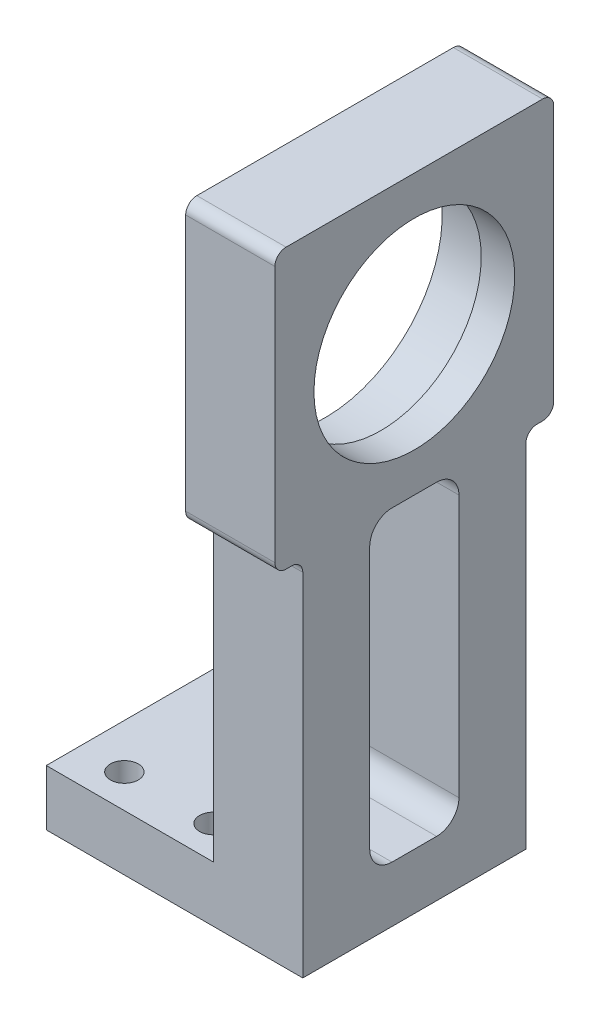
ISO-10303-21;
HEADER;
FILE_DESCRIPTION(('STEP AP214'),'2;1');
FILE_NAME('part.step','',(''),(''),'','','');
FILE_SCHEMA(('AUTOMOTIVE_DESIGN { 1 0 10303 214 1 1 1 1 }'));
ENDSEC;
DATA;
#1=APPLICATION_CONTEXT('core data for automotive mechanical design processes');
#2=APPLICATION_PROTOCOL_DEFINITION('international standard','automotive_design',2000,#1);
#3=PRODUCT_CONTEXT('',#1,'mechanical');
#4=PRODUCT('Part','Part','',(#3));
#5=PRODUCT_RELATED_PRODUCT_CATEGORY('part','',(#4));
#6=PRODUCT_DEFINITION_FORMATION('','',#4);
#7=PRODUCT_DEFINITION_CONTEXT('part definition',#1,'design');
#8=PRODUCT_DEFINITION('design','',#6,#7);
#9=PRODUCT_DEFINITION_SHAPE('','',#8);
#10=(LENGTH_UNIT() NAMED_UNIT(*) SI_UNIT(.MILLI.,.METRE.));
#11=(NAMED_UNIT(*) PLANE_ANGLE_UNIT() SI_UNIT($,.RADIAN.));
#12=(NAMED_UNIT(*) SI_UNIT($,.STERADIAN.) SOLID_ANGLE_UNIT());
#13=UNCERTAINTY_MEASURE_WITH_UNIT(LENGTH_MEASURE(1.E-05),#10,'distance_accuracy_value','');
#14=(GEOMETRIC_REPRESENTATION_CONTEXT(3) GLOBAL_UNCERTAINTY_ASSIGNED_CONTEXT((#13)) GLOBAL_UNIT_ASSIGNED_CONTEXT((#10,
#11,#12)) REPRESENTATION_CONTEXT('',''));
#15=CARTESIAN_POINT('',(0.,0.,0.));
#16=DIRECTION('',(0.,0.,1.));
#17=DIRECTION('',(1.,0.,0.));
#18=AXIS2_PLACEMENT_3D('',#15,#16,#17);
#19=CARTESIAN_POINT('',(0.,5.,0.));
#20=DIRECTION('',(0.,-1.,0.));
#21=DIRECTION('',(0.,0.,-1.));
#22=AXIS2_PLACEMENT_3D('',#19,#20,#21);
#23=PLANE('',#22);
#24=CARTESIAN_POINT('',(4.,5.,-3.));
#25=DIRECTION('',(0.,1.,0.));
#26=DIRECTION('',(0.,0.,1.));
#27=AXIS2_PLACEMENT_3D('',#24,#25,#26);
#28=CIRCLE('',#27,1.25);
#29=CARTESIAN_POINT('',(4.,5.,-1.75));
#30=VERTEX_POINT('',#29);
#31=EDGE_CURVE('E820',#30,#30,#28,.T.);
#32=ORIENTED_EDGE('',*,*,#31,.F.);
#33=EDGE_LOOP('',(#32));
#34=FACE_BOUND('',#33,.T.);
#35=CARTESIAN_POINT('',(12.,5.,-17.));
#36=DIRECTION('',(0.,1.,0.));
#37=DIRECTION('',(0.,0.,-1.));
#38=AXIS2_PLACEMENT_3D('',#35,#36,#37);
#39=CIRCLE('',#38,1.25);
#40=CARTESIAN_POINT('',(12.,5.,-18.25));
#41=VERTEX_POINT('',#40);
#42=EDGE_CURVE('E827',#41,#41,#39,.T.);
#43=ORIENTED_EDGE('',*,*,#42,.F.);
#44=EDGE_LOOP('',(#43));
#45=FACE_BOUND('',#44,.T.);
#46=CARTESIAN_POINT('',(4.,5.,-17.));
#47=DIRECTION('',(0.,1.,0.));
#48=DIRECTION('',(0.,0.,-1.));
#49=AXIS2_PLACEMENT_3D('',#46,#47,#48);
#50=CIRCLE('',#49,1.25);
#51=CARTESIAN_POINT('',(4.,5.,-18.25));
#52=VERTEX_POINT('',#51);
#53=EDGE_CURVE('E809',#52,#52,#50,.T.);
#54=ORIENTED_EDGE('',*,*,#53,.F.);
#55=EDGE_LOOP('',(#54));
#56=FACE_BOUND('',#55,.T.);
#57=CARTESIAN_POINT('',(12.,5.,-3.));
#58=DIRECTION('',(0.,1.,0.));
#59=DIRECTION('',(0.,0.,1.));
#60=AXIS2_PLACEMENT_3D('',#57,#58,#59);
#61=CIRCLE('',#60,1.25);
#62=CARTESIAN_POINT('',(12.,5.,-1.75));
#63=VERTEX_POINT('',#62);
#64=EDGE_CURVE('E364',#63,#63,#61,.T.);
#65=ORIENTED_EDGE('',*,*,#64,.F.);
#66=EDGE_LOOP('',(#65));
#67=FACE_BOUND('',#66,.T.);
#68=DIRECTION('',(0.,0.,1.));
#69=VECTOR('',#68,1.);
#70=CARTESIAN_POINT('',(23.,5.,0.));
#71=LINE('',#70,#69);
#72=CARTESIAN_POINT('',(23.,5.,-12.));
#73=VERTEX_POINT('',#72);
#74=CARTESIAN_POINT('',(23.,5.,-7.99999999999999));
#75=VERTEX_POINT('',#74);
#76=EDGE_CURVE('E355',#73,#75,#71,.T.);
#77=ORIENTED_EDGE('',*,*,#76,.F.);
#78=DIRECTION('',(1.,0.,0.));
#79=VECTOR('',#78,1.);
#80=CARTESIAN_POINT('',(0.,5.,-12.));
#81=LINE('',#80,#79);
#82=CARTESIAN_POINT('',(15.,5.,-12.));
#83=VERTEX_POINT('',#82);
#84=EDGE_CURVE('E336',#73,#83,#81,.F.);
#85=ORIENTED_EDGE('',*,*,#84,.T.);
#86=DIRECTION('',(0.,0.,1.));
#87=VECTOR('',#86,1.);
#88=CARTESIAN_POINT('',(15.,5.,0.));
#89=LINE('',#88,#87);
#90=CARTESIAN_POINT('',(15.,5.,-20.));
#91=VERTEX_POINT('',#90);
#92=EDGE_CURVE('E51',#91,#83,#89,.T.);
#93=ORIENTED_EDGE('',*,*,#92,.F.);
#94=DIRECTION('',(-1.,0.,0.));
#95=VECTOR('',#94,1.);
#96=CARTESIAN_POINT('',(0.,5.,-20.));
#97=LINE('',#96,#95);
#98=CARTESIAN_POINT('',(0.,5.,-20.));
#99=VERTEX_POINT('',#98);
#100=EDGE_CURVE('E258',#91,#99,#97,.T.);
#101=ORIENTED_EDGE('',*,*,#100,.T.);
#102=DIRECTION('',(0.,0.,1.));
#103=VECTOR('',#102,1.);
#104=CARTESIAN_POINT('',(0.,5.,0.));
#105=LINE('',#104,#103);
#106=CARTESIAN_POINT('',(0.,5.,0.));
#107=VERTEX_POINT('',#106);
#108=EDGE_CURVE('E253',#99,#107,#105,.T.);
#109=ORIENTED_EDGE('',*,*,#108,.T.);
#110=DIRECTION('',(1.,0.,0.));
#111=VECTOR('',#110,1.);
#112=CARTESIAN_POINT('',(0.,5.,0.));
#113=LINE('',#112,#111);
#114=CARTESIAN_POINT('',(15.,5.,0.));
#115=VERTEX_POINT('',#114);
#116=EDGE_CURVE('E256',#107,#115,#113,.T.);
#117=ORIENTED_EDGE('',*,*,#116,.T.);
#118=CARTESIAN_POINT('',(15.,5.,-7.99999999999999));
#119=VERTEX_POINT('',#118);
#120=EDGE_CURVE('E59',#119,#115,#89,.T.);
#121=ORIENTED_EDGE('',*,*,#120,.F.);
#122=DIRECTION('',(1.,0.,0.));
#123=VECTOR('',#122,1.);
#124=CARTESIAN_POINT('',(23.,5.,-7.99999999999999));
#125=LINE('',#124,#123);
#126=EDGE_CURVE('E334',#119,#75,#125,.T.);
#127=ORIENTED_EDGE('',*,*,#126,.T.);
#128=EDGE_LOOP('',(#77,#85,#93,#101,#109,#117,#121,#127));
#129=FACE_BOUND('',#128,.T.);
#130=ADVANCED_FACE('F36',(#34,#45,#56,#67,#129),#23,.F.);
#131=CARTESIAN_POINT('',(0.,5.,0.));
#132=DIRECTION('',(1.,0.,0.));
#133=DIRECTION('',(0.,0.,-1.));
#134=AXIS2_PLACEMENT_3D('',#131,#132,#133);
#135=PLANE('',#134);
#136=DIRECTION('',(0.,0.,1.));
#137=VECTOR('',#136,1.);
#138=CARTESIAN_POINT('',(0.,0.,0.));
#139=LINE('',#138,#137);
#140=CARTESIAN_POINT('',(0.,0.,-20.));
#141=VERTEX_POINT('',#140);
#142=CARTESIAN_POINT('',(0.,0.,0.));
#143=VERTEX_POINT('',#142);
#144=EDGE_CURVE('E221',#141,#143,#139,.T.);
#145=ORIENTED_EDGE('',*,*,#144,.T.);
#146=DIRECTION('',(0.,-1.,0.));
#147=VECTOR('',#146,1.);
#148=CARTESIAN_POINT('',(0.,5.,0.));
#149=LINE('',#148,#147);
#150=EDGE_CURVE('E216',#107,#143,#149,.T.);
#151=ORIENTED_EDGE('',*,*,#150,.F.);
#152=ORIENTED_EDGE('',*,*,#108,.F.);
#153=DIRECTION('',(0.,-1.,0.));
#154=VECTOR('',#153,1.);
#155=CARTESIAN_POINT('',(0.,5.,-20.));
#156=LINE('',#155,#154);
#157=EDGE_CURVE('E260',#99,#141,#156,.T.);
#158=ORIENTED_EDGE('',*,*,#157,.T.);
#159=EDGE_LOOP('',(#145,#151,#152,#158));
#160=FACE_BOUND('',#159,.T.);
#161=ADVANCED_FACE('F445',(#160),#135,.F.);
#162=CARTESIAN_POINT('',(0.,5.,0.));
#163=DIRECTION('',(0.,0.,-1.));
#164=DIRECTION('',(-1.,0.,0.));
#165=AXIS2_PLACEMENT_3D('',#162,#163,#164);
#166=PLANE('',#165);
#167=DIRECTION('',(0.,-1.,0.));
#168=VECTOR('',#167,1.);
#169=CARTESIAN_POINT('',(23.,0.,0.));
#170=LINE('',#169,#168);
#171=CARTESIAN_POINT('',(23.,31.5,0.));
#172=VERTEX_POINT('',#171);
#173=CARTESIAN_POINT('',(23.,0.,0.));
#174=VERTEX_POINT('',#173);
#175=EDGE_CURVE('E198',#172,#174,#170,.T.);
#176=ORIENTED_EDGE('',*,*,#175,.F.);
#177=DIRECTION('',(1.,0.,0.));
#178=VECTOR('',#177,1.);
#179=CARTESIAN_POINT('',(0.,31.5,0.));
#180=LINE('',#179,#178);
#181=CARTESIAN_POINT('',(15.,31.5,0.));
#182=VERTEX_POINT('',#181);
#183=EDGE_CURVE('E310',#172,#182,#180,.F.);
#184=ORIENTED_EDGE('',*,*,#183,.T.);
#185=DIRECTION('',(0.,-1.,0.));
#186=VECTOR('',#185,1.);
#187=CARTESIAN_POINT('',(15.,0.,0.));
#188=LINE('',#187,#186);
#189=EDGE_CURVE('E250',#182,#115,#188,.T.);
#190=ORIENTED_EDGE('',*,*,#189,.T.);
#191=ORIENTED_EDGE('',*,*,#116,.F.);
#192=ORIENTED_EDGE('',*,*,#150,.T.);
#193=DIRECTION('',(1.,0.,0.));
#194=VECTOR('',#193,1.);
#195=CARTESIAN_POINT('',(0.,0.,0.));
#196=LINE('',#195,#194);
#197=EDGE_CURVE('E213',#143,#174,#196,.T.);
#198=ORIENTED_EDGE('',*,*,#197,.T.);
#199=EDGE_LOOP('',(#176,#184,#190,#191,#192,#198));
#200=FACE_BOUND('',#199,.T.);
#201=ADVANCED_FACE('F214',(#200),#166,.F.);
#202=CARTESIAN_POINT('',(0.,5.,-20.));
#203=DIRECTION('',(0.,0.,1.));
#204=DIRECTION('',(1.,0.,0.));
#205=AXIS2_PLACEMENT_3D('',#202,#203,#204);
#206=PLANE('',#205);
#207=DIRECTION('',(0.,1.,0.));
#208=VECTOR('',#207,1.);
#209=CARTESIAN_POINT('',(15.,0.,-20.));
#210=LINE('',#209,#208);
#211=CARTESIAN_POINT('',(15.,31.5,-20.));
#212=VERTEX_POINT('',#211);
#213=EDGE_CURVE('E238',#91,#212,#210,.T.);
#214=ORIENTED_EDGE('',*,*,#213,.T.);
#215=DIRECTION('',(1.,0.,0.));
#216=VECTOR('',#215,1.);
#217=CARTESIAN_POINT('',(0.,31.5,-20.));
#218=LINE('',#217,#216);
#219=CARTESIAN_POINT('',(23.,31.5,-20.));
#220=VERTEX_POINT('',#219);
#221=EDGE_CURVE('E266',#212,#220,#218,.T.);
#222=ORIENTED_EDGE('',*,*,#221,.T.);
#223=DIRECTION('',(0.,1.,0.));
#224=VECTOR('',#223,1.);
#225=CARTESIAN_POINT('',(23.,0.,-20.));
#226=LINE('',#225,#224);
#227=CARTESIAN_POINT('',(23.,0.,-20.));
#228=VERTEX_POINT('',#227);
#229=EDGE_CURVE('E387',#228,#220,#226,.T.);
#230=ORIENTED_EDGE('',*,*,#229,.F.);
#231=DIRECTION('',(-1.,0.,0.));
#232=VECTOR('',#231,1.);
#233=CARTESIAN_POINT('',(0.,0.,-20.));
#234=LINE('',#233,#232);
#235=EDGE_CURVE('E220',#228,#141,#234,.T.);
#236=ORIENTED_EDGE('',*,*,#235,.T.);
#237=ORIENTED_EDGE('',*,*,#157,.F.);
#238=ORIENTED_EDGE('',*,*,#100,.F.);
#239=EDGE_LOOP('',(#214,#222,#230,#236,#237,#238));
#240=FACE_BOUND('',#239,.T.);
#241=ADVANCED_FACE('F447',(#240),#206,.F.);
#242=CARTESIAN_POINT('',(0.,0.,0.));
#243=DIRECTION('',(0.,-1.,0.));
#244=DIRECTION('',(0.,0.,-1.));
#245=AXIS2_PLACEMENT_3D('',#242,#243,#244);
#246=PLANE('',#245);
#247=CARTESIAN_POINT('',(4.,0.,-3.));
#248=DIRECTION('',(0.,-1.,0.));
#249=DIRECTION('',(0.,0.,-1.));
#250=AXIS2_PLACEMENT_3D('',#247,#248,#249);
#251=CIRCLE('',#250,1.25);
#252=CARTESIAN_POINT('',(4.,0.,-4.25));
#253=VERTEX_POINT('',#252);
#254=EDGE_CURVE('E824',#253,#253,#251,.F.);
#255=ORIENTED_EDGE('',*,*,#254,.T.);
#256=EDGE_LOOP('',(#255));
#257=FACE_BOUND('',#256,.T.);
#258=CARTESIAN_POINT('',(12.,0.,-17.));
#259=DIRECTION('',(0.,-1.,0.));
#260=DIRECTION('',(0.,0.,-1.));
#261=AXIS2_PLACEMENT_3D('',#258,#259,#260);
#262=CIRCLE('',#261,1.25);
#263=CARTESIAN_POINT('',(12.,0.,-18.25));
#264=VERTEX_POINT('',#263);
#265=EDGE_CURVE('E818',#264,#264,#262,.F.);
#266=ORIENTED_EDGE('',*,*,#265,.T.);
#267=EDGE_LOOP('',(#266));
#268=FACE_BOUND('',#267,.T.);
#269=CARTESIAN_POINT('',(4.,0.,-17.));
#270=DIRECTION('',(0.,-1.,0.));
#271=DIRECTION('',(0.,0.,-1.));
#272=AXIS2_PLACEMENT_3D('',#269,#270,#271);
#273=CIRCLE('',#272,1.25);
#274=CARTESIAN_POINT('',(4.,0.,-18.25));
#275=VERTEX_POINT('',#274);
#276=EDGE_CURVE('E805',#275,#275,#273,.F.);
#277=ORIENTED_EDGE('',*,*,#276,.T.);
#278=EDGE_LOOP('',(#277));
#279=FACE_BOUND('',#278,.T.);
#280=CARTESIAN_POINT('',(12.,0.,-3.));
#281=DIRECTION('',(0.,-1.,0.));
#282=DIRECTION('',(0.,0.,-1.));
#283=AXIS2_PLACEMENT_3D('',#280,#281,#282);
#284=CIRCLE('',#283,1.25);
#285=CARTESIAN_POINT('',(12.,0.,-4.25));
#286=VERTEX_POINT('',#285);
#287=EDGE_CURVE('E823',#286,#286,#284,.F.);
#288=ORIENTED_EDGE('',*,*,#287,.T.);
#289=EDGE_LOOP('',(#288));
#290=FACE_BOUND('',#289,.T.);
#291=DIRECTION('',(0.,0.,-1.));
#292=VECTOR('',#291,1.);
#293=CARTESIAN_POINT('',(23.,0.,0.));
#294=LINE('',#293,#292);
#295=EDGE_CURVE('E204',#174,#228,#294,.T.);
#296=ORIENTED_EDGE('',*,*,#295,.F.);
#297=ORIENTED_EDGE('',*,*,#197,.F.);
#298=ORIENTED_EDGE('',*,*,#144,.F.);
#299=ORIENTED_EDGE('',*,*,#235,.F.);
#300=EDGE_LOOP('',(#296,#297,#298,#299));
#301=FACE_BOUND('',#300,.T.);
#302=ADVANCED_FACE('F223',(#257,#268,#279,#290,#301),#246,.T.);
#303=CARTESIAN_POINT('',(15.,0.,0.));
#304=DIRECTION('',(1.,0.,0.));
#305=DIRECTION('',(0.,0.,-1.));
#306=AXIS2_PLACEMENT_3D('',#303,#304,#305);
#307=PLANE('',#306);
#308=CARTESIAN_POINT('',(15.,45.,-9.99999999999999));
#309=DIRECTION('',(-1.,0.,0.));
#310=DIRECTION('',(0.,0.,1.));
#311=AXIS2_PLACEMENT_3D('',#308,#309,#310);
#312=CIRCLE('',#311,10.5);
#313=CARTESIAN_POINT('',(15.,45.,0.500000000000011));
#314=VERTEX_POINT('',#313);
#315=EDGE_CURVE('E806',#314,#314,#312,.T.);
#316=ORIENTED_EDGE('',*,*,#315,.F.);
#317=EDGE_LOOP('',(#316));
#318=FACE_BOUND('',#317,.T.);
#319=DIRECTION('',(0.,1.,0.));
#320=VECTOR('',#319,1.);
#321=CARTESIAN_POINT('',(15.,0.,-22.5));
#322=LINE('',#321,#320);
#323=CARTESIAN_POINT('',(15.,33.5,-22.5));
#324=VERTEX_POINT('',#323);
#325=CARTESIAN_POINT('',(15.,56.5,-22.5));
#326=VERTEX_POINT('',#325);
#327=EDGE_CURVE('E241',#324,#326,#322,.T.);
#328=ORIENTED_EDGE('',*,*,#327,.F.);
#329=CARTESIAN_POINT('',(15.,33.5,-21.5));
#330=DIRECTION('',(1.,0.,0.));
#331=DIRECTION('',(0.,0.,-1.));
#332=AXIS2_PLACEMENT_3D('',#329,#330,#331);
#333=CIRCLE('',#332,1.);
#334=CARTESIAN_POINT('',(15.,32.5,-21.5));
#335=VERTEX_POINT('',#334);
#336=EDGE_CURVE('E293',#324,#335,#333,.F.);
#337=ORIENTED_EDGE('',*,*,#336,.T.);
#338=DIRECTION('',(0.,0.,-1.));
#339=VECTOR('',#338,1.);
#340=CARTESIAN_POINT('',(15.,32.5,0.));
#341=LINE('',#340,#339);
#342=CARTESIAN_POINT('',(15.,32.5,-21.));
#343=VERTEX_POINT('',#342);
#344=EDGE_CURVE('E235',#343,#335,#341,.T.);
#345=ORIENTED_EDGE('',*,*,#344,.F.);
#346=CARTESIAN_POINT('',(15.,31.5,-21.));
#347=DIRECTION('',(1.,0.,0.));
#348=DIRECTION('',(0.,0.,-1.));
#349=AXIS2_PLACEMENT_3D('',#346,#347,#348);
#350=CIRCLE('',#349,1.);
#351=EDGE_CURVE('E314',#343,#212,#350,.T.);
#352=ORIENTED_EDGE('',*,*,#351,.T.);
#353=ORIENTED_EDGE('',*,*,#213,.F.);
#354=ORIENTED_EDGE('',*,*,#92,.T.);
#355=CARTESIAN_POINT('',(15.,7.,-12.));
#356=DIRECTION('',(1.,0.,0.));
#357=DIRECTION('',(0.,0.,-1.));
#358=AXIS2_PLACEMENT_3D('',#355,#356,#357);
#359=CIRCLE('',#358,2.);
#360=CARTESIAN_POINT('',(15.,7.,-14.));
#361=VERTEX_POINT('',#360);
#362=EDGE_CURVE('E348',#83,#361,#359,.T.);
#363=ORIENTED_EDGE('',*,*,#362,.T.);
#364=DIRECTION('',(0.,-1.,0.));
#365=VECTOR('',#364,1.);
#366=CARTESIAN_POINT('',(15.,0.,-14.));
#367=LINE('',#366,#365);
#368=CARTESIAN_POINT('',(15.,30.5,-14.));
#369=VERTEX_POINT('',#368);
#370=EDGE_CURVE('E233',#369,#361,#367,.T.);
#371=ORIENTED_EDGE('',*,*,#370,.F.);
#372=CARTESIAN_POINT('',(15.,30.5,-12.));
#373=DIRECTION('',(1.,0.,0.));
#374=DIRECTION('',(0.,0.,-1.));
#375=AXIS2_PLACEMENT_3D('',#372,#373,#374);
#376=CIRCLE('',#375,2.);
#377=CARTESIAN_POINT('',(15.,32.5,-12.));
#378=VERTEX_POINT('',#377);
#379=EDGE_CURVE('E344',#369,#378,#376,.T.);
#380=ORIENTED_EDGE('',*,*,#379,.T.);
#381=CARTESIAN_POINT('',(15.,32.5,-7.99999999999999));
#382=VERTEX_POINT('',#381);
#383=EDGE_CURVE('E227',#382,#378,#341,.T.);
#384=ORIENTED_EDGE('',*,*,#383,.F.);
#385=CARTESIAN_POINT('',(15.,30.5,-7.99999999999999));
#386=DIRECTION('',(1.,0.,0.));
#387=DIRECTION('',(0.,0.,-1.));
#388=AXIS2_PLACEMENT_3D('',#385,#386,#387);
#389=CIRCLE('',#388,2.);
#390=CARTESIAN_POINT('',(15.,30.5,-5.99999999999999));
#391=VERTEX_POINT('',#390);
#392=EDGE_CURVE('E340',#382,#391,#389,.T.);
#393=ORIENTED_EDGE('',*,*,#392,.T.);
#394=DIRECTION('',(0.,-1.,0.));
#395=VECTOR('',#394,1.);
#396=CARTESIAN_POINT('',(15.,0.,-6.));
#397=LINE('',#396,#395);
#398=CARTESIAN_POINT('',(15.,7.,-6.));
#399=VERTEX_POINT('',#398);
#400=EDGE_CURVE('E224',#391,#399,#397,.T.);
#401=ORIENTED_EDGE('',*,*,#400,.T.);
#402=CARTESIAN_POINT('',(15.,7.,-7.99999999999999));
#403=DIRECTION('',(1.,0.,0.));
#404=DIRECTION('',(0.,0.,-1.));
#405=AXIS2_PLACEMENT_3D('',#402,#403,#404);
#406=CIRCLE('',#405,2.);
#407=EDGE_CURVE('E11',#399,#119,#406,.T.);
#408=ORIENTED_EDGE('',*,*,#407,.T.);
#409=ORIENTED_EDGE('',*,*,#120,.T.);
#410=ORIENTED_EDGE('',*,*,#189,.F.);
#411=CARTESIAN_POINT('',(15.,31.5,1.));
#412=DIRECTION('',(1.,0.,0.));
#413=DIRECTION('',(0.,0.,-1.));
#414=AXIS2_PLACEMENT_3D('',#411,#412,#413);
#415=CIRCLE('',#414,1.);
#416=CARTESIAN_POINT('',(15.,32.5,1.));
#417=VERTEX_POINT('',#416);
#418=EDGE_CURVE('E317',#182,#417,#415,.T.);
#419=ORIENTED_EDGE('',*,*,#418,.T.);
#420=CARTESIAN_POINT('',(15.,32.5,1.50000000000001));
#421=VERTEX_POINT('',#420);
#422=EDGE_CURVE('E234',#421,#417,#341,.T.);
#423=ORIENTED_EDGE('',*,*,#422,.F.);
#424=CARTESIAN_POINT('',(15.,33.5,1.50000000000001));
#425=DIRECTION('',(1.,0.,0.));
#426=DIRECTION('',(0.,0.,-1.));
#427=AXIS2_PLACEMENT_3D('',#424,#425,#426);
#428=CIRCLE('',#427,1.);
#429=CARTESIAN_POINT('',(15.,33.5,2.50000000000001));
#430=VERTEX_POINT('',#429);
#431=EDGE_CURVE('E287',#421,#430,#428,.F.);
#432=ORIENTED_EDGE('',*,*,#431,.T.);
#433=DIRECTION('',(0.,1.,0.));
#434=VECTOR('',#433,1.);
#435=CARTESIAN_POINT('',(15.,0.,2.49999999999999));
#436=LINE('',#435,#434);
#437=CARTESIAN_POINT('',(15.,56.5,2.50000000000002));
#438=VERTEX_POINT('',#437);
#439=EDGE_CURVE('E247',#430,#438,#436,.T.);
#440=ORIENTED_EDGE('',*,*,#439,.T.);
#441=CARTESIAN_POINT('',(15.,56.5,1.50000000000002));
#442=DIRECTION('',(1.,0.,0.));
#443=DIRECTION('',(0.,0.,-1.));
#444=AXIS2_PLACEMENT_3D('',#441,#442,#443);
#445=CIRCLE('',#444,1.);
#446=CARTESIAN_POINT('',(15.,57.5,1.50000000000002));
#447=VERTEX_POINT('',#446);
#448=EDGE_CURVE('E289',#438,#447,#445,.F.);
#449=ORIENTED_EDGE('',*,*,#448,.T.);
#450=DIRECTION('',(0.,0.,-1.));
#451=VECTOR('',#450,1.);
#452=CARTESIAN_POINT('',(15.,57.5,0.));
#453=LINE('',#452,#451);
#454=CARTESIAN_POINT('',(15.,57.5,-21.5));
#455=VERTEX_POINT('',#454);
#456=EDGE_CURVE('E244',#447,#455,#453,.T.);
#457=ORIENTED_EDGE('',*,*,#456,.T.);
#458=CARTESIAN_POINT('',(15.,56.5,-21.5));
#459=DIRECTION('',(1.,0.,0.));
#460=DIRECTION('',(0.,0.,-1.));
#461=AXIS2_PLACEMENT_3D('',#458,#459,#460);
#462=CIRCLE('',#461,1.);
#463=EDGE_CURVE('E291',#455,#326,#462,.F.);
#464=ORIENTED_EDGE('',*,*,#463,.T.);
#465=EDGE_LOOP('',(#328,#337,#345,#352,#353,#354,#363,#371,#380,#384,#393,#401,#408,#409,#410,
#419,#423,#432,#440,#449,#457,#464));
#466=FACE_BOUND('',#465,.T.);
#467=ADVANCED_FACE('F368',(#318,#466),#307,.F.);
#468=CARTESIAN_POINT('',(15.,32.5,0.));
#469=DIRECTION('',(0.,-1.,0.));
#470=DIRECTION('',(0.,0.,-1.));
#471=AXIS2_PLACEMENT_3D('',#468,#469,#470);
#472=PLANE('',#471);
#473=DIRECTION('',(0.,0.,-1.));
#474=VECTOR('',#473,1.);
#475=CARTESIAN_POINT('',(23.,32.5,0.));
#476=LINE('',#475,#474);
#477=CARTESIAN_POINT('',(23.,32.5,1.50000000000001));
#478=VERTEX_POINT('',#477);
#479=CARTESIAN_POINT('',(23.,32.5,1.));
#480=VERTEX_POINT('',#479);
#481=EDGE_CURVE('E210',#478,#480,#476,.T.);
#482=ORIENTED_EDGE('',*,*,#481,.F.);
#483=DIRECTION('',(1.,0.,0.));
#484=VECTOR('',#483,1.);
#485=CARTESIAN_POINT('',(15.,32.5,1.50000000000001));
#486=LINE('',#485,#484);
#487=EDGE_CURVE('E308',#478,#421,#486,.F.);
#488=ORIENTED_EDGE('',*,*,#487,.T.);
#489=ORIENTED_EDGE('',*,*,#422,.T.);
#490=DIRECTION('',(1.,0.,0.));
#491=VECTOR('',#490,1.);
#492=CARTESIAN_POINT('',(15.,32.5,1.));
#493=LINE('',#492,#491);
#494=EDGE_CURVE('E305',#417,#480,#493,.T.);
#495=ORIENTED_EDGE('',*,*,#494,.T.);
#496=EDGE_LOOP('',(#482,#488,#489,#495));
#497=FACE_BOUND('',#496,.T.);
#498=ADVANCED_FACE('F435',(#497),#472,.T.);
#499=CARTESIAN_POINT('',(15.,0.,2.49999999999999));
#500=DIRECTION('',(0.,0.,-1.));
#501=DIRECTION('',(0.,1.,0.));
#502=AXIS2_PLACEMENT_3D('',#499,#500,#501);
#503=PLANE('',#502);
#504=DIRECTION('',(0.,1.,0.));
#505=VECTOR('',#504,1.);
#506=CARTESIAN_POINT('',(23.,0.,2.49999999999999));
#507=LINE('',#506,#505);
#508=CARTESIAN_POINT('',(23.,33.5,2.50000000000001));
#509=VERTEX_POINT('',#508);
#510=CARTESIAN_POINT('',(23.,56.5,2.50000000000002));
#511=VERTEX_POINT('',#510);
#512=EDGE_CURVE('E385',#509,#511,#507,.T.);
#513=ORIENTED_EDGE('',*,*,#512,.T.);
#514=DIRECTION('',(1.,0.,0.));
#515=VECTOR('',#514,1.);
#516=CARTESIAN_POINT('',(15.,56.5,2.50000000000002));
#517=LINE('',#516,#515);
#518=EDGE_CURVE('E303',#511,#438,#517,.F.);
#519=ORIENTED_EDGE('',*,*,#518,.T.);
#520=ORIENTED_EDGE('',*,*,#439,.F.);
#521=DIRECTION('',(1.,0.,0.));
#522=VECTOR('',#521,1.);
#523=CARTESIAN_POINT('',(23.,33.5,2.50000000000001));
#524=LINE('',#523,#522);
#525=EDGE_CURVE('E300',#430,#509,#524,.T.);
#526=ORIENTED_EDGE('',*,*,#525,.T.);
#527=EDGE_LOOP('',(#513,#519,#520,#526));
#528=FACE_BOUND('',#527,.T.);
#529=ADVANCED_FACE('F400',(#528),#503,.F.);
#530=CARTESIAN_POINT('',(15.,57.5,0.));
#531=DIRECTION('',(0.,-1.,0.));
#532=DIRECTION('',(0.,0.,-1.));
#533=AXIS2_PLACEMENT_3D('',#530,#531,#532);
#534=PLANE('',#533);
#535=DIRECTION('',(0.,0.,-1.));
#536=VECTOR('',#535,1.);
#537=CARTESIAN_POINT('',(23.,57.5,0.));
#538=LINE('',#537,#536);
#539=CARTESIAN_POINT('',(23.,57.5,1.50000000000002));
#540=VERTEX_POINT('',#539);
#541=CARTESIAN_POINT('',(23.,57.5,-21.5));
#542=VERTEX_POINT('',#541);
#543=EDGE_CURVE('E390',#540,#542,#538,.T.);
#544=ORIENTED_EDGE('',*,*,#543,.T.);
#545=DIRECTION('',(1.,0.,0.));
#546=VECTOR('',#545,1.);
#547=CARTESIAN_POINT('',(15.,57.5,-21.5));
#548=LINE('',#547,#546);
#549=EDGE_CURVE('E298',#542,#455,#548,.F.);
#550=ORIENTED_EDGE('',*,*,#549,.T.);
#551=ORIENTED_EDGE('',*,*,#456,.F.);
#552=DIRECTION('',(1.,0.,0.));
#553=VECTOR('',#552,1.);
#554=CARTESIAN_POINT('',(15.,57.5,1.50000000000002));
#555=LINE('',#554,#553);
#556=EDGE_CURVE('E295',#447,#540,#555,.T.);
#557=ORIENTED_EDGE('',*,*,#556,.T.);
#558=EDGE_LOOP('',(#544,#550,#551,#557));
#559=FACE_BOUND('',#558,.T.);
#560=ADVANCED_FACE('F410',(#559),#534,.F.);
#561=CARTESIAN_POINT('',(15.,0.,-22.5));
#562=DIRECTION('',(0.,0.,-1.));
#563=DIRECTION('',(-1.,0.,0.));
#564=AXIS2_PLACEMENT_3D('',#561,#562,#563);
#565=PLANE('',#564);
#566=DIRECTION('',(0.,1.,0.));
#567=VECTOR('',#566,1.);
#568=CARTESIAN_POINT('',(23.,0.,-22.5));
#569=LINE('',#568,#567);
#570=CARTESIAN_POINT('',(23.,33.5,-22.5));
#571=VERTEX_POINT('',#570);
#572=CARTESIAN_POINT('',(23.,56.5,-22.5));
#573=VERTEX_POINT('',#572);
#574=EDGE_CURVE('E386',#571,#573,#569,.T.);
#575=ORIENTED_EDGE('',*,*,#574,.F.);
#576=DIRECTION('',(1.,0.,0.));
#577=VECTOR('',#576,1.);
#578=CARTESIAN_POINT('',(15.,33.5,-22.5));
#579=LINE('',#578,#577);
#580=EDGE_CURVE('E285',#571,#324,#579,.F.);
#581=ORIENTED_EDGE('',*,*,#580,.T.);
#582=ORIENTED_EDGE('',*,*,#327,.T.);
#583=DIRECTION('',(1.,0.,0.));
#584=VECTOR('',#583,1.);
#585=CARTESIAN_POINT('',(23.,56.5,-22.5));
#586=LINE('',#585,#584);
#587=EDGE_CURVE('E282',#326,#573,#586,.T.);
#588=ORIENTED_EDGE('',*,*,#587,.T.);
#589=EDGE_LOOP('',(#575,#581,#582,#588));
#590=FACE_BOUND('',#589,.T.);
#591=ADVANCED_FACE('F419',(#590),#565,.T.);
#592=CARTESIAN_POINT('',(15.,0.,-6.));
#593=DIRECTION('',(0.,0.,1.));
#594=DIRECTION('',(0.,-1.,0.));
#595=AXIS2_PLACEMENT_3D('',#592,#593,#594);
#596=PLANE('',#595);
#597=ORIENTED_EDGE('',*,*,#400,.F.);
#598=DIRECTION('',(1.,0.,0.));
#599=VECTOR('',#598,1.);
#600=CARTESIAN_POINT('',(15.,30.5,-5.99999999999999));
#601=LINE('',#600,#599);
#602=CARTESIAN_POINT('',(23.,30.5,-5.99999999999999));
#603=VERTEX_POINT('',#602);
#604=EDGE_CURVE('E321',#391,#603,#601,.T.);
#605=ORIENTED_EDGE('',*,*,#604,.T.);
#606=DIRECTION('',(0.,-1.,0.));
#607=VECTOR('',#606,1.);
#608=CARTESIAN_POINT('',(23.,0.,-6.));
#609=LINE('',#608,#607);
#610=CARTESIAN_POINT('',(23.,7.,-6.));
#611=VERTEX_POINT('',#610);
#612=EDGE_CURVE('E353',#603,#611,#609,.T.);
#613=ORIENTED_EDGE('',*,*,#612,.T.);
#614=DIRECTION('',(1.,0.,0.));
#615=VECTOR('',#614,1.);
#616=CARTESIAN_POINT('',(15.,7.,-6.));
#617=LINE('',#616,#615);
#618=EDGE_CURVE('E319',#611,#399,#617,.F.);
#619=ORIENTED_EDGE('',*,*,#618,.T.);
#620=EDGE_LOOP('',(#597,#605,#613,#619));
#621=FACE_BOUND('',#620,.T.);
#622=ADVANCED_FACE('F361',(#621),#596,.F.);
#623=CARTESIAN_POINT('',(15.,0.,-14.));
#624=DIRECTION('',(0.,0.,1.));
#625=DIRECTION('',(0.,-1.,0.));
#626=AXIS2_PLACEMENT_3D('',#623,#624,#625);
#627=PLANE('',#626);
#628=DIRECTION('',(0.,-1.,0.));
#629=VECTOR('',#628,1.);
#630=CARTESIAN_POINT('',(23.,0.,-14.));
#631=LINE('',#630,#629);
#632=CARTESIAN_POINT('',(23.,30.5,-14.));
#633=VERTEX_POINT('',#632);
#634=CARTESIAN_POINT('',(23.,7.,-14.));
#635=VERTEX_POINT('',#634);
#636=EDGE_CURVE('E380',#633,#635,#631,.T.);
#637=ORIENTED_EDGE('',*,*,#636,.F.);
#638=DIRECTION('',(1.,0.,0.));
#639=VECTOR('',#638,1.);
#640=CARTESIAN_POINT('',(15.,30.5,-14.));
#641=LINE('',#640,#639);
#642=EDGE_CURVE('E332',#633,#369,#641,.F.);
#643=ORIENTED_EDGE('',*,*,#642,.T.);
#644=ORIENTED_EDGE('',*,*,#370,.T.);
#645=DIRECTION('',(1.,0.,0.));
#646=VECTOR('',#645,1.);
#647=CARTESIAN_POINT('',(15.,7.,-14.));
#648=LINE('',#647,#646);
#649=EDGE_CURVE('E329',#361,#635,#648,.T.);
#650=ORIENTED_EDGE('',*,*,#649,.T.);
#651=EDGE_LOOP('',(#637,#643,#644,#650));
#652=FACE_BOUND('',#651,.T.);
#653=ADVANCED_FACE('F532',(#652),#627,.T.);
#654=CARTESIAN_POINT('',(23.,32.5,-7.99999999999999));
#655=VERTEX_POINT('',#654);
#656=CARTESIAN_POINT('',(23.,32.5,-12.));
#657=VERTEX_POINT('',#656);
#658=EDGE_CURVE('E363',#655,#657,#476,.T.);
#659=ORIENTED_EDGE('',*,*,#658,.F.);
#660=DIRECTION('',(1.,0.,0.));
#661=VECTOR('',#660,1.);
#662=CARTESIAN_POINT('',(15.,32.5,-7.99999999999999));
#663=LINE('',#662,#661);
#664=EDGE_CURVE('E327',#655,#382,#663,.F.);
#665=ORIENTED_EDGE('',*,*,#664,.T.);
#666=ORIENTED_EDGE('',*,*,#383,.T.);
#667=DIRECTION('',(1.,0.,0.));
#668=VECTOR('',#667,1.);
#669=CARTESIAN_POINT('',(23.,32.5,-12.));
#670=LINE('',#669,#668);
#671=EDGE_CURVE('E324',#378,#657,#670,.T.);
#672=ORIENTED_EDGE('',*,*,#671,.T.);
#673=EDGE_LOOP('',(#659,#665,#666,#672));
#674=FACE_BOUND('',#673,.T.);
#675=ADVANCED_FACE('F378',(#674),#472,.T.);
#676=CARTESIAN_POINT('',(23.,32.5,-21.));
#677=VERTEX_POINT('',#676);
#678=CARTESIAN_POINT('',(23.,32.5,-21.5));
#679=VERTEX_POINT('',#678);
#680=EDGE_CURVE('E382',#677,#679,#476,.T.);
#681=ORIENTED_EDGE('',*,*,#680,.F.);
#682=DIRECTION('',(1.,0.,0.));
#683=VECTOR('',#682,1.);
#684=CARTESIAN_POINT('',(15.,32.5,-21.));
#685=LINE('',#684,#683);
#686=EDGE_CURVE('E272',#677,#343,#685,.F.);
#687=ORIENTED_EDGE('',*,*,#686,.T.);
#688=ORIENTED_EDGE('',*,*,#344,.T.);
#689=DIRECTION('',(1.,0.,0.));
#690=VECTOR('',#689,1.);
#691=CARTESIAN_POINT('',(15.,32.5,-21.5));
#692=LINE('',#691,#690);
#693=EDGE_CURVE('E269',#335,#679,#692,.T.);
#694=ORIENTED_EDGE('',*,*,#693,.T.);
#695=EDGE_LOOP('',(#681,#687,#688,#694));
#696=FACE_BOUND('',#695,.T.);
#697=ADVANCED_FACE('F428',(#696),#472,.T.);
#698=CARTESIAN_POINT('',(23.,0.,0.));
#699=DIRECTION('',(1.,0.,0.));
#700=DIRECTION('',(0.,0.,-1.));
#701=AXIS2_PLACEMENT_3D('',#698,#699,#700);
#702=PLANE('',#701);
#703=CARTESIAN_POINT('',(23.,45.,-9.99999999999999));
#704=DIRECTION('',(1.,0.,0.));
#705=DIRECTION('',(0.,0.,-1.));
#706=AXIS2_PLACEMENT_3D('',#703,#704,#705);
#707=CIRCLE('',#706,9.);
#708=CARTESIAN_POINT('',(23.,45.,-0.99999999999999));
#709=VERTEX_POINT('',#708);
#710=EDGE_CURVE('E814',#709,#709,#707,.F.);
#711=ORIENTED_EDGE('',*,*,#710,.T.);
#712=EDGE_LOOP('',(#711));
#713=FACE_BOUND('',#712,.T.);
#714=ORIENTED_EDGE('',*,*,#612,.F.);
#715=CARTESIAN_POINT('',(23.,30.5,-7.99999999999999));
#716=DIRECTION('',(1.,0.,0.));
#717=DIRECTION('',(0.,0.,-1.));
#718=AXIS2_PLACEMENT_3D('',#715,#716,#717);
#719=CIRCLE('',#718,2.);
#720=EDGE_CURVE('E338',#603,#655,#719,.F.);
#721=ORIENTED_EDGE('',*,*,#720,.T.);
#722=ORIENTED_EDGE('',*,*,#658,.T.);
#723=CARTESIAN_POINT('',(23.,30.5,-12.));
#724=DIRECTION('',(1.,0.,0.));
#725=DIRECTION('',(0.,0.,-1.));
#726=AXIS2_PLACEMENT_3D('',#723,#724,#725);
#727=CIRCLE('',#726,2.);
#728=EDGE_CURVE('E342',#657,#633,#727,.F.);
#729=ORIENTED_EDGE('',*,*,#728,.T.);
#730=ORIENTED_EDGE('',*,*,#636,.T.);
#731=CARTESIAN_POINT('',(23.,7.,-12.));
#732=DIRECTION('',(1.,0.,0.));
#733=DIRECTION('',(0.,0.,-1.));
#734=AXIS2_PLACEMENT_3D('',#731,#732,#733);
#735=CIRCLE('',#734,2.);
#736=EDGE_CURVE('E346',#635,#73,#735,.F.);
#737=ORIENTED_EDGE('',*,*,#736,.T.);
#738=ORIENTED_EDGE('',*,*,#76,.T.);
#739=CARTESIAN_POINT('',(23.,7.,-7.99999999999999));
#740=DIRECTION('',(1.,0.,0.));
#741=DIRECTION('',(0.,0.,-1.));
#742=AXIS2_PLACEMENT_3D('',#739,#740,#741);
#743=CIRCLE('',#742,2.);
#744=EDGE_CURVE('E44',#75,#611,#743,.F.);
#745=ORIENTED_EDGE('',*,*,#744,.T.);
#746=EDGE_LOOP('',(#714,#721,#722,#729,#730,#737,#738,#745));
#747=FACE_BOUND('',#746,.T.);
#748=ORIENTED_EDGE('',*,*,#680,.T.);
#749=CARTESIAN_POINT('',(23.,33.5,-21.5));
#750=DIRECTION('',(1.,0.,0.));
#751=DIRECTION('',(0.,0.,-1.));
#752=AXIS2_PLACEMENT_3D('',#749,#750,#751);
#753=CIRCLE('',#752,1.);
#754=EDGE_CURVE('E280',#679,#571,#753,.T.);
#755=ORIENTED_EDGE('',*,*,#754,.T.);
#756=ORIENTED_EDGE('',*,*,#574,.T.);
#757=CARTESIAN_POINT('',(23.,56.5,-21.5));
#758=DIRECTION('',(1.,0.,0.));
#759=DIRECTION('',(0.,0.,-1.));
#760=AXIS2_PLACEMENT_3D('',#757,#758,#759);
#761=CIRCLE('',#760,1.);
#762=EDGE_CURVE('E278',#573,#542,#761,.T.);
#763=ORIENTED_EDGE('',*,*,#762,.T.);
#764=ORIENTED_EDGE('',*,*,#543,.F.);
#765=CARTESIAN_POINT('',(23.,56.5,1.50000000000002));
#766=DIRECTION('',(1.,0.,0.));
#767=DIRECTION('',(0.,0.,-1.));
#768=AXIS2_PLACEMENT_3D('',#765,#766,#767);
#769=CIRCLE('',#768,1.);
#770=EDGE_CURVE('E276',#540,#511,#769,.T.);
#771=ORIENTED_EDGE('',*,*,#770,.T.);
#772=ORIENTED_EDGE('',*,*,#512,.F.);
#773=CARTESIAN_POINT('',(23.,33.5,1.50000000000001));
#774=DIRECTION('',(1.,0.,0.));
#775=DIRECTION('',(0.,0.,-1.));
#776=AXIS2_PLACEMENT_3D('',#773,#774,#775);
#777=CIRCLE('',#776,1.);
#778=EDGE_CURVE('E274',#509,#478,#777,.T.);
#779=ORIENTED_EDGE('',*,*,#778,.T.);
#780=ORIENTED_EDGE('',*,*,#481,.T.);
#781=CARTESIAN_POINT('',(23.,31.5,1.));
#782=DIRECTION('',(1.,0.,0.));
#783=DIRECTION('',(0.,0.,-1.));
#784=AXIS2_PLACEMENT_3D('',#781,#782,#783);
#785=CIRCLE('',#784,1.);
#786=EDGE_CURVE('E207',#480,#172,#785,.F.);
#787=ORIENTED_EDGE('',*,*,#786,.T.);
#788=ORIENTED_EDGE('',*,*,#175,.T.);
#789=ORIENTED_EDGE('',*,*,#295,.T.);
#790=ORIENTED_EDGE('',*,*,#229,.T.);
#791=CARTESIAN_POINT('',(23.,31.5,-21.));
#792=DIRECTION('',(1.,0.,0.));
#793=DIRECTION('',(0.,0.,-1.));
#794=AXIS2_PLACEMENT_3D('',#791,#792,#793);
#795=CIRCLE('',#794,1.);
#796=EDGE_CURVE('E312',#220,#677,#795,.F.);
#797=ORIENTED_EDGE('',*,*,#796,.T.);
#798=EDGE_LOOP('',(#748,#755,#756,#763,#764,#771,#772,#779,#780,#787,#788,#789,#790,#797));
#799=FACE_BOUND('',#798,.T.);
#800=ADVANCED_FACE('F201',(#713,#747,#799),#702,.T.);
#801=CARTESIAN_POINT('',(12.,-0.00100000000000013,-3.));
#802=DIRECTION('',(0.,1.,0.));
#803=DIRECTION('',(0.,0.,1.));
#804=AXIS2_PLACEMENT_3D('',#801,#802,#803);
#805=CYLINDRICAL_SURFACE('',#804,1.25);
#806=ORIENTED_EDGE('',*,*,#287,.F.);
#807=EDGE_LOOP('',(#806));
#808=FACE_BOUND('',#807,.T.);
#809=ORIENTED_EDGE('',*,*,#64,.T.);
#810=EDGE_LOOP('',(#809));
#811=FACE_BOUND('',#810,.T.);
#812=ADVANCED_FACE('F553',(#808,#811),#805,.F.);
#813=CARTESIAN_POINT('',(4.,-0.00100000000000013,-17.));
#814=DIRECTION('',(0.,1.,0.));
#815=DIRECTION('',(0.,0.,1.));
#816=AXIS2_PLACEMENT_3D('',#813,#814,#815);
#817=CYLINDRICAL_SURFACE('',#816,1.25);
#818=ORIENTED_EDGE('',*,*,#276,.F.);
#819=EDGE_LOOP('',(#818));
#820=FACE_BOUND('',#819,.T.);
#821=ORIENTED_EDGE('',*,*,#53,.T.);
#822=EDGE_LOOP('',(#821));
#823=FACE_BOUND('',#822,.T.);
#824=ADVANCED_FACE('F561',(#820,#823),#817,.F.);
#825=CARTESIAN_POINT('',(12.,-0.00100000000000013,-17.));
#826=DIRECTION('',(0.,1.,0.));
#827=DIRECTION('',(0.,0.,1.));
#828=AXIS2_PLACEMENT_3D('',#825,#826,#827);
#829=CYLINDRICAL_SURFACE('',#828,1.25);
#830=ORIENTED_EDGE('',*,*,#265,.F.);
#831=EDGE_LOOP('',(#830));
#832=FACE_BOUND('',#831,.T.);
#833=ORIENTED_EDGE('',*,*,#42,.T.);
#834=EDGE_LOOP('',(#833));
#835=FACE_BOUND('',#834,.T.);
#836=ADVANCED_FACE('F569',(#832,#835),#829,.F.);
#837=CARTESIAN_POINT('',(4.,-0.00100000000000013,-3.));
#838=DIRECTION('',(0.,1.,0.));
#839=DIRECTION('',(0.,0.,1.));
#840=AXIS2_PLACEMENT_3D('',#837,#838,#839);
#841=CYLINDRICAL_SURFACE('',#840,1.25);
#842=ORIENTED_EDGE('',*,*,#254,.F.);
#843=EDGE_LOOP('',(#842));
#844=FACE_BOUND('',#843,.T.);
#845=ORIENTED_EDGE('',*,*,#31,.T.);
#846=EDGE_LOOP('',(#845));
#847=FACE_BOUND('',#846,.T.);
#848=ADVANCED_FACE('F577',(#844,#847),#841,.F.);
#849=CARTESIAN_POINT('',(20.,45.,-9.99999999999999));
#850=DIRECTION('',(-1.,0.,0.));
#851=DIRECTION('',(0.,0.,1.));
#852=AXIS2_PLACEMENT_3D('',#849,#850,#851);
#853=CYLINDRICAL_SURFACE('',#852,10.5);
#854=CARTESIAN_POINT('',(20.,45.,-9.99999999999999));
#855=DIRECTION('',(-1.,0.,0.));
#856=DIRECTION('',(0.,0.,1.));
#857=AXIS2_PLACEMENT_3D('',#854,#855,#856);
#858=CIRCLE('',#857,10.5);
#859=CARTESIAN_POINT('',(20.,45.,0.500000000000011));
#860=VERTEX_POINT('',#859);
#861=EDGE_CURVE('E804',#860,#860,#858,.T.);
#862=ORIENTED_EDGE('',*,*,#861,.F.);
#863=EDGE_LOOP('',(#862));
#864=FACE_BOUND('',#863,.T.);
#865=ORIENTED_EDGE('',*,*,#315,.T.);
#866=EDGE_LOOP('',(#865));
#867=FACE_BOUND('',#866,.T.);
#868=ADVANCED_FACE('F585',(#864,#867),#853,.F.);
#869=CARTESIAN_POINT('',(20.,45.,-9.99999999999999));
#870=DIRECTION('',(-1.,0.,0.));
#871=DIRECTION('',(0.,0.,1.));
#872=AXIS2_PLACEMENT_3D('',#869,#870,#871);
#873=PLANE('',#872);
#874=CARTESIAN_POINT('',(20.,45.,-9.99999999999999));
#875=DIRECTION('',(-1.,0.,0.));
#876=DIRECTION('',(0.,0.,1.));
#877=AXIS2_PLACEMENT_3D('',#874,#875,#876);
#878=CIRCLE('',#877,9.);
#879=CARTESIAN_POINT('',(20.,45.,-0.99999999999999));
#880=VERTEX_POINT('',#879);
#881=EDGE_CURVE('E801',#880,#880,#878,.T.);
#882=ORIENTED_EDGE('',*,*,#881,.F.);
#883=EDGE_LOOP('',(#882));
#884=FACE_BOUND('',#883,.T.);
#885=ORIENTED_EDGE('',*,*,#861,.T.);
#886=EDGE_LOOP('',(#885));
#887=FACE_BOUND('',#886,.T.);
#888=ADVANCED_FACE('F459',(#884,#887),#873,.T.);
#889=CARTESIAN_POINT('',(23.001,45.,-9.99999999999999));
#890=DIRECTION('',(-1.,0.,0.));
#891=DIRECTION('',(0.,0.,1.));
#892=AXIS2_PLACEMENT_3D('',#889,#890,#891);
#893=CYLINDRICAL_SURFACE('',#892,9.);
#894=CARTESIAN_POINT('',(23.,45.,-0.99999999999999));
#895=CARTESIAN_POINT('',(22.96875,45.,-0.99999999999999));
#896=CARTESIAN_POINT('',(22.9375,45.,-0.99999999999999));
#897=CARTESIAN_POINT('',(22.875,45.,-0.99999999999999));
#898=CARTESIAN_POINT('',(22.84375,45.,-0.99999999999999));
#899=CARTESIAN_POINT('',(22.78125,45.,-0.99999999999999));
#900=CARTESIAN_POINT('',(22.75,45.,-0.99999999999999));
#901=CARTESIAN_POINT('',(22.6875,45.,-0.99999999999999));
#902=CARTESIAN_POINT('',(22.65625,45.,-0.99999999999999));
#903=CARTESIAN_POINT('',(22.59375,45.,-0.99999999999999));
#904=CARTESIAN_POINT('',(22.5625,45.,-0.99999999999999));
#905=CARTESIAN_POINT('',(22.5,45.,-0.99999999999999));
#906=CARTESIAN_POINT('',(22.46875,45.,-0.99999999999999));
#907=CARTESIAN_POINT('',(22.40625,45.,-0.99999999999999));
#908=CARTESIAN_POINT('',(22.375,45.,-0.99999999999999));
#909=CARTESIAN_POINT('',(22.3125,45.,-0.99999999999999));
#910=CARTESIAN_POINT('',(22.28125,45.,-0.99999999999999));
#911=CARTESIAN_POINT('',(22.21875,45.,-0.99999999999999));
#912=CARTESIAN_POINT('',(22.1875,45.,-0.99999999999999));
#913=CARTESIAN_POINT('',(22.125,45.,-0.99999999999999));
#914=CARTESIAN_POINT('',(22.09375,45.,-0.99999999999999));
#915=CARTESIAN_POINT('',(22.03125,45.,-0.99999999999999));
#916=CARTESIAN_POINT('',(22.,45.,-0.99999999999999));
#917=CARTESIAN_POINT('',(21.9375,45.,-0.99999999999999));
#918=CARTESIAN_POINT('',(21.90625,45.,-0.99999999999999));
#919=CARTESIAN_POINT('',(21.84375,45.,-0.99999999999999));
#920=CARTESIAN_POINT('',(21.8125,45.,-0.99999999999999));
#921=CARTESIAN_POINT('',(21.75,45.,-0.99999999999999));
#922=CARTESIAN_POINT('',(21.71875,45.,-0.99999999999999));
#923=CARTESIAN_POINT('',(21.65625,45.,-0.99999999999999));
#924=CARTESIAN_POINT('',(21.625,45.,-0.99999999999999));
#925=CARTESIAN_POINT('',(21.5625,45.,-0.99999999999999));
#926=CARTESIAN_POINT('',(21.53125,45.,-0.99999999999999));
#927=CARTESIAN_POINT('',(21.46875,45.,-0.99999999999999));
#928=CARTESIAN_POINT('',(21.4375,45.,-0.99999999999999));
#929=CARTESIAN_POINT('',(21.375,45.,-0.99999999999999));
#930=CARTESIAN_POINT('',(21.34375,45.,-0.99999999999999));
#931=CARTESIAN_POINT('',(21.28125,45.,-0.99999999999999));
#932=CARTESIAN_POINT('',(21.25,45.,-0.99999999999999));
#933=CARTESIAN_POINT('',(21.1875,45.,-0.99999999999999));
#934=CARTESIAN_POINT('',(21.15625,45.,-0.99999999999999));
#935=CARTESIAN_POINT('',(21.09375,45.,-0.99999999999999));
#936=CARTESIAN_POINT('',(21.0625,45.,-0.99999999999999));
#937=CARTESIAN_POINT('',(21.,45.,-0.99999999999999));
#938=CARTESIAN_POINT('',(20.96875,45.,-0.99999999999999));
#939=CARTESIAN_POINT('',(20.90625,45.,-0.99999999999999));
#940=CARTESIAN_POINT('',(20.875,45.,-0.99999999999999));
#941=CARTESIAN_POINT('',(20.8125,45.,-0.99999999999999));
#942=CARTESIAN_POINT('',(20.78125,45.,-0.99999999999999));
#943=CARTESIAN_POINT('',(20.71875,45.,-0.99999999999999));
#944=CARTESIAN_POINT('',(20.6875,45.,-0.99999999999999));
#945=CARTESIAN_POINT('',(20.625,45.,-0.99999999999999));
#946=CARTESIAN_POINT('',(20.59375,45.,-0.99999999999999));
#947=CARTESIAN_POINT('',(20.53125,45.,-0.99999999999999));
#948=CARTESIAN_POINT('',(20.5,45.,-0.99999999999999));
#949=CARTESIAN_POINT('',(20.4375,45.,-0.99999999999999));
#950=CARTESIAN_POINT('',(20.40625,45.,-0.99999999999999));
#951=CARTESIAN_POINT('',(20.34375,45.,-0.99999999999999));
#952=CARTESIAN_POINT('',(20.3125,45.,-0.99999999999999));
#953=CARTESIAN_POINT('',(20.25,45.,-0.99999999999999));
#954=CARTESIAN_POINT('',(20.21875,45.,-0.99999999999999));
#955=CARTESIAN_POINT('',(20.15625,45.,-0.99999999999999));
#956=CARTESIAN_POINT('',(20.125,45.,-0.99999999999999));
#957=CARTESIAN_POINT('',(20.0625,45.,-0.99999999999999));
#958=CARTESIAN_POINT('',(20.03125,45.,-0.99999999999999));
#959=CARTESIAN_POINT('',(20.,45.,-0.99999999999999));
#960=B_SPLINE_CURVE_WITH_KNOTS('',3,(#894,#895,#896,#897,#898,#899,#900,#901,#902,#903,#904,
#905,#906,#907,#908,#909,#910,#911,#912,#913,#914,#915,#916,#917,#918,#919,#920,#921,#922,#923,
#924,#925,#926,#927,#928,#929,#930,#931,#932,#933,#934,#935,#936,#937,#938,#939,#940,#941,#942,
#943,#944,#945,#946,#947,#948,#949,#950,#951,#952,#953,#954,#955,#956,#957,#958,#959),
.UNSPECIFIED.,.F.,.F.,(4,2,2,2,2,2,2,2,2,2,2,2,2,2,2,2,2,2,2,2,2,2,2,2,2,2,2,2,2,2,2,2,4),(0.,
0.0937499999999966,0.187499999999997,0.281249999999997,0.374999999999997,0.468749999999997,
0.562499999999997,0.656249999999997,0.749999999999997,0.843749999999997,0.937499999999997,
1.03125,1.125,1.21875,1.3125,1.40625,1.5,1.59374999999999,1.68749999999999,1.78124999999999,
1.87499999999999,1.96874999999999,2.06249999999999,2.15625,2.25,2.34375,2.4375,2.53125,2.625,
2.71875,2.8125,2.90625,3.),.UNSPECIFIED.);
#961=EDGE_CURVE('BSEAM452',#709,#880,#960,.T.);
#962=ORIENTED_EDGE('',*,*,#710,.F.);
#963=ORIENTED_EDGE('',*,*,#881,.T.);
#964=ORIENTED_EDGE('',*,*,#961,.T.);
#965=ORIENTED_EDGE('',*,*,#961,.F.);
#966=EDGE_LOOP('',(#962,#964,#963,#965));
#967=FACE_BOUND('',#966,.T.);
#968=ADVANCED_FACE('F452',(#967),#893,.F.);
#969=CARTESIAN_POINT('',(0.,31.5,-21.));
#970=DIRECTION('',(1.,0.,0.));
#971=DIRECTION('',(0.,0.,-1.));
#972=AXIS2_PLACEMENT_3D('',#969,#970,#971);
#973=CYLINDRICAL_SURFACE('',#972,1.);
#974=ORIENTED_EDGE('',*,*,#351,.F.);
#975=ORIENTED_EDGE('',*,*,#686,.F.);
#976=ORIENTED_EDGE('',*,*,#796,.F.);
#977=ORIENTED_EDGE('',*,*,#221,.F.);
#978=EDGE_LOOP('',(#974,#975,#976,#977));
#979=FACE_BOUND('',#978,.T.);
#980=ADVANCED_FACE('F450',(#979),#973,.F.);
#981=CARTESIAN_POINT('',(15.,33.5,-21.5));
#982=DIRECTION('',(1.,0.,0.));
#983=DIRECTION('',(0.,0.,-1.));
#984=AXIS2_PLACEMENT_3D('',#981,#982,#983);
#985=CYLINDRICAL_SURFACE('',#984,1.);
#986=ORIENTED_EDGE('',*,*,#336,.F.);
#987=ORIENTED_EDGE('',*,*,#580,.F.);
#988=ORIENTED_EDGE('',*,*,#754,.F.);
#989=ORIENTED_EDGE('',*,*,#693,.F.);
#990=EDGE_LOOP('',(#986,#987,#988,#989));
#991=FACE_BOUND('',#990,.T.);
#992=ADVANCED_FACE('F422',(#991),#985,.T.);
#993=CARTESIAN_POINT('',(15.,56.5,-21.5));
#994=DIRECTION('',(-1.,0.,0.));
#995=DIRECTION('',(0.,0.,1.));
#996=AXIS2_PLACEMENT_3D('',#993,#994,#995);
#997=CYLINDRICAL_SURFACE('',#996,1.);
#998=ORIENTED_EDGE('',*,*,#463,.F.);
#999=ORIENTED_EDGE('',*,*,#549,.F.);
#1000=ORIENTED_EDGE('',*,*,#762,.F.);
#1001=ORIENTED_EDGE('',*,*,#587,.F.);
#1002=EDGE_LOOP('',(#998,#999,#1000,#1001));
#1003=FACE_BOUND('',#1002,.T.);
#1004=ADVANCED_FACE('F414',(#1003),#997,.T.);
#1005=CARTESIAN_POINT('',(15.,56.5,1.50000000000002));
#1006=DIRECTION('',(1.,0.,0.));
#1007=DIRECTION('',(0.,0.,-1.));
#1008=AXIS2_PLACEMENT_3D('',#1005,#1006,#1007);
#1009=CYLINDRICAL_SURFACE('',#1008,1.);
#1010=ORIENTED_EDGE('',*,*,#448,.F.);
#1011=ORIENTED_EDGE('',*,*,#518,.F.);
#1012=ORIENTED_EDGE('',*,*,#770,.F.);
#1013=ORIENTED_EDGE('',*,*,#556,.F.);
#1014=EDGE_LOOP('',(#1010,#1011,#1012,#1013));
#1015=FACE_BOUND('',#1014,.T.);
#1016=ADVANCED_FACE('F405',(#1015),#1009,.T.);
#1017=CARTESIAN_POINT('',(15.,33.5,1.50000000000001));
#1018=DIRECTION('',(-1.,0.,0.));
#1019=DIRECTION('',(0.,0.,1.));
#1020=AXIS2_PLACEMENT_3D('',#1017,#1018,#1019);
#1021=CYLINDRICAL_SURFACE('',#1020,1.);
#1022=ORIENTED_EDGE('',*,*,#431,.F.);
#1023=ORIENTED_EDGE('',*,*,#487,.F.);
#1024=ORIENTED_EDGE('',*,*,#778,.F.);
#1025=ORIENTED_EDGE('',*,*,#525,.F.);
#1026=EDGE_LOOP('',(#1022,#1023,#1024,#1025));
#1027=FACE_BOUND('',#1026,.T.);
#1028=ADVANCED_FACE('F632',(#1027),#1021,.T.);
#1029=CARTESIAN_POINT('',(15.,31.5,1.));
#1030=DIRECTION('',(1.,0.,0.));
#1031=DIRECTION('',(0.,0.,-1.));
#1032=AXIS2_PLACEMENT_3D('',#1029,#1030,#1031);
#1033=CYLINDRICAL_SURFACE('',#1032,1.);
#1034=ORIENTED_EDGE('',*,*,#418,.F.);
#1035=ORIENTED_EDGE('',*,*,#183,.F.);
#1036=ORIENTED_EDGE('',*,*,#786,.F.);
#1037=ORIENTED_EDGE('',*,*,#494,.F.);
#1038=EDGE_LOOP('',(#1034,#1035,#1036,#1037));
#1039=FACE_BOUND('',#1038,.T.);
#1040=ADVANCED_FACE('F440',(#1039),#1033,.F.);
#1041=CARTESIAN_POINT('',(15.,30.5,-7.99999999999999));
#1042=DIRECTION('',(1.,0.,0.));
#1043=DIRECTION('',(0.,0.,-1.));
#1044=AXIS2_PLACEMENT_3D('',#1041,#1042,#1043);
#1045=CYLINDRICAL_SURFACE('',#1044,2.);
#1046=ORIENTED_EDGE('',*,*,#392,.F.);
#1047=ORIENTED_EDGE('',*,*,#664,.F.);
#1048=ORIENTED_EDGE('',*,*,#720,.F.);
#1049=ORIENTED_EDGE('',*,*,#604,.F.);
#1050=EDGE_LOOP('',(#1046,#1047,#1048,#1049));
#1051=FACE_BOUND('',#1050,.T.);
#1052=ADVANCED_FACE('F373',(#1051),#1045,.F.);
#1053=CARTESIAN_POINT('',(15.,30.5,-12.));
#1054=DIRECTION('',(-1.,0.,0.));
#1055=DIRECTION('',(0.,0.,1.));
#1056=AXIS2_PLACEMENT_3D('',#1053,#1054,#1055);
#1057=CYLINDRICAL_SURFACE('',#1056,2.);
#1058=ORIENTED_EDGE('',*,*,#379,.F.);
#1059=ORIENTED_EDGE('',*,*,#642,.F.);
#1060=ORIENTED_EDGE('',*,*,#728,.F.);
#1061=ORIENTED_EDGE('',*,*,#671,.F.);
#1062=EDGE_LOOP('',(#1058,#1059,#1060,#1061));
#1063=FACE_BOUND('',#1062,.T.);
#1064=ADVANCED_FACE('F654',(#1063),#1057,.F.);
#1065=CARTESIAN_POINT('',(15.,7.,-12.));
#1066=DIRECTION('',(1.,0.,0.));
#1067=DIRECTION('',(0.,0.,-1.));
#1068=AXIS2_PLACEMENT_3D('',#1065,#1066,#1067);
#1069=CYLINDRICAL_SURFACE('',#1068,2.);
#1070=ORIENTED_EDGE('',*,*,#362,.F.);
#1071=ORIENTED_EDGE('',*,*,#84,.F.);
#1072=ORIENTED_EDGE('',*,*,#736,.F.);
#1073=ORIENTED_EDGE('',*,*,#649,.F.);
#1074=EDGE_LOOP('',(#1070,#1071,#1072,#1073));
#1075=FACE_BOUND('',#1074,.T.);
#1076=ADVANCED_FACE('F662',(#1075),#1069,.F.);
#1077=CARTESIAN_POINT('',(0.,7.,-7.99999999999999));
#1078=DIRECTION('',(-1.,0.,0.));
#1079=DIRECTION('',(0.,0.,1.));
#1080=AXIS2_PLACEMENT_3D('',#1077,#1078,#1079);
#1081=CYLINDRICAL_SURFACE('',#1080,2.);
#1082=ORIENTED_EDGE('',*,*,#407,.F.);
#1083=ORIENTED_EDGE('',*,*,#618,.F.);
#1084=ORIENTED_EDGE('',*,*,#744,.F.);
#1085=ORIENTED_EDGE('',*,*,#126,.F.);
#1086=EDGE_LOOP('',(#1082,#1083,#1084,#1085));
#1087=FACE_BOUND('',#1086,.T.);
#1088=ADVANCED_FACE('F38',(#1087),#1081,.F.);
#1089=CLOSED_SHELL('',(#130,#161,#201,#241,#302,#467,#498,#529,#560,#591,#622,#653,#675,#697,
#800,#812,#824,#836,#848,#868,#888,#968,#980,#992,#1004,#1016,#1028,#1040,#1052,#1064,#1076,#1088));
#1090=MANIFOLD_SOLID_BREP('B2',#1089);
#1091=ADVANCED_BREP_SHAPE_REPRESENTATION('',(#18,#1090),#14);
#1092=SHAPE_DEFINITION_REPRESENTATION(#9,#1091);
ENDSEC;
END-ISO-10303-21;
